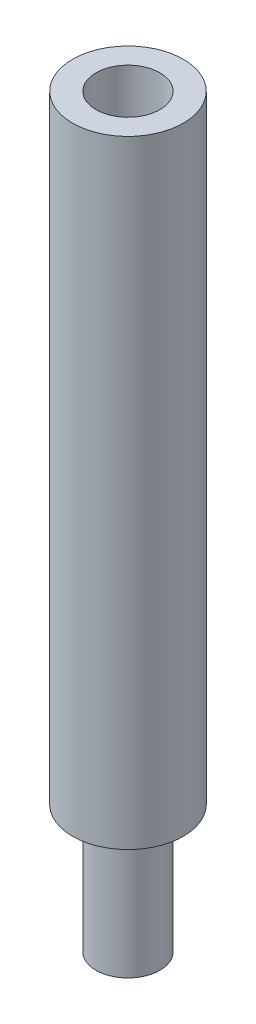
ISO-10303-21;
HEADER;
FILE_DESCRIPTION(('STEP AP214'),'2;1');
FILE_NAME('part.step','',(''),(''),'','','');
FILE_SCHEMA(('AUTOMOTIVE_DESIGN { 1 0 10303 214 1 1 1 1 }'));
ENDSEC;
DATA;
#1=APPLICATION_CONTEXT('core data for automotive mechanical design processes');
#2=APPLICATION_PROTOCOL_DEFINITION('international standard','automotive_design',2000,#1);
#3=PRODUCT_CONTEXT('',#1,'mechanical');
#4=PRODUCT('Part','Part','',(#3));
#5=PRODUCT_RELATED_PRODUCT_CATEGORY('part','',(#4));
#6=PRODUCT_DEFINITION_FORMATION('','',#4);
#7=PRODUCT_DEFINITION_CONTEXT('part definition',#1,'design');
#8=PRODUCT_DEFINITION('design','',#6,#7);
#9=PRODUCT_DEFINITION_SHAPE('','',#8);
#10=(LENGTH_UNIT() NAMED_UNIT(*) SI_UNIT(.MILLI.,.METRE.));
#11=(NAMED_UNIT(*) PLANE_ANGLE_UNIT() SI_UNIT($,.RADIAN.));
#12=(NAMED_UNIT(*) SI_UNIT($,.STERADIAN.) SOLID_ANGLE_UNIT());
#13=UNCERTAINTY_MEASURE_WITH_UNIT(LENGTH_MEASURE(1.E-05),#10,'distance_accuracy_value','');
#14=(GEOMETRIC_REPRESENTATION_CONTEXT(3) GLOBAL_UNCERTAINTY_ASSIGNED_CONTEXT((#13)) GLOBAL_UNIT_ASSIGNED_CONTEXT((#10,
#11,#12)) REPRESENTATION_CONTEXT('',''));
#15=CARTESIAN_POINT('',(0.,0.,0.));
#16=DIRECTION('',(0.,0.,1.));
#17=DIRECTION('',(1.,0.,0.));
#18=AXIS2_PLACEMENT_3D('',#15,#16,#17);
#19=CARTESIAN_POINT('',(0.,14.5,2.59999999999999));
#20=DIRECTION('',(0.,1.,0.));
#21=DIRECTION('',(0.,0.,1.));
#22=AXIS2_PLACEMENT_3D('',#19,#20,#21);
#23=PLANE('',#22);
#24=CARTESIAN_POINT('',(0.,14.5,0.));
#25=DIRECTION('',(0.,1.,0.));
#26=DIRECTION('',(0.,0.,1.));
#27=AXIS2_PLACEMENT_3D('',#24,#25,#26);
#28=CIRCLE('',#27,2.59999999999999);
#29=CARTESIAN_POINT('',(0.,14.5,2.59999999999999));
#30=VERTEX_POINT('',#29);
#31=EDGE_CURVE('E53',#30,#30,#28,.T.);
#32=ORIENTED_EDGE('',*,*,#31,.T.);
#33=EDGE_LOOP('',(#32));
#34=FACE_BOUND('',#33,.T.);
#35=CARTESIAN_POINT('',(0.,14.5,0.));
#36=DIRECTION('',(0.,1.,0.));
#37=DIRECTION('',(0.,0.,1.));
#38=AXIS2_PLACEMENT_3D('',#35,#36,#37);
#39=CIRCLE('',#38,1.49999999999999);
#40=CARTESIAN_POINT('',(0.,14.5,1.49999999999999));
#41=VERTEX_POINT('',#40);
#42=EDGE_CURVE('E10',#41,#41,#39,.T.);
#43=ORIENTED_EDGE('',*,*,#42,.F.);
#44=EDGE_LOOP('',(#43));
#45=FACE_BOUND('',#44,.T.);
#46=ADVANCED_FACE('F31',(#34,#45),#23,.T.);
#47=CARTESIAN_POINT('',(0.,27.5397967343063,0.));
#48=DIRECTION('',(0.,1.,0.));
#49=DIRECTION('',(0.,0.,1.));
#50=AXIS2_PLACEMENT_3D('',#47,#48,#49);
#51=CYLINDRICAL_SURFACE('',#50,1.5);
#52=ORIENTED_EDGE('',*,*,#42,.T.);
#53=EDGE_LOOP('',(#52));
#54=FACE_BOUND('',#53,.T.);
#55=CARTESIAN_POINT('',(0.,8.5,0.));
#56=DIRECTION('',(0.,1.,0.));
#57=DIRECTION('',(0.,0.,1.));
#58=AXIS2_PLACEMENT_3D('',#55,#56,#57);
#59=CIRCLE('',#58,1.5);
#60=CARTESIAN_POINT('',(0.,8.5,1.5));
#61=VERTEX_POINT('',#60);
#62=EDGE_CURVE('E37',#61,#61,#59,.T.);
#63=ORIENTED_EDGE('',*,*,#62,.F.);
#64=EDGE_LOOP('',(#63));
#65=FACE_BOUND('',#64,.T.);
#66=ADVANCED_FACE('F71',(#54,#65),#51,.F.);
#67=CARTESIAN_POINT('',(0.,8.5,1.5));
#68=DIRECTION('',(0.,1.,0.));
#69=DIRECTION('',(0.,0.,1.));
#70=AXIS2_PLACEMENT_3D('',#67,#68,#69);
#71=PLANE('',#70);
#72=ORIENTED_EDGE('',*,*,#62,.T.);
#73=EDGE_LOOP('',(#72));
#74=FACE_BOUND('',#73,.T.);
#75=ADVANCED_FACE('F75',(#74),#71,.T.);
#76=CARTESIAN_POINT('',(0.,-20.5,1.49999999999999));
#77=DIRECTION('',(0.,-1.,0.));
#78=DIRECTION('',(0.,0.,-1.));
#79=AXIS2_PLACEMENT_3D('',#76,#77,#78);
#80=PLANE('',#79);
#81=CARTESIAN_POINT('',(0.,-20.5,0.));
#82=DIRECTION('',(0.,1.,0.));
#83=DIRECTION('',(0.,0.,1.));
#84=AXIS2_PLACEMENT_3D('',#81,#82,#83);
#85=CIRCLE('',#84,1.49999999999999);
#86=CARTESIAN_POINT('',(0.,-20.5,1.49999999999999));
#87=VERTEX_POINT('',#86);
#88=EDGE_CURVE('E41',#87,#87,#85,.T.);
#89=ORIENTED_EDGE('',*,*,#88,.F.);
#90=EDGE_LOOP('',(#89));
#91=FACE_BOUND('',#90,.T.);
#92=ADVANCED_FACE('F79',(#91),#80,.T.);
#93=CARTESIAN_POINT('',(0.,27.5397967343063,0.));
#94=DIRECTION('',(0.,1.,0.));
#95=DIRECTION('',(0.,0.,1.));
#96=AXIS2_PLACEMENT_3D('',#93,#94,#95);
#97=CYLINDRICAL_SURFACE('',#96,1.49999999999999);
#98=ORIENTED_EDGE('',*,*,#88,.T.);
#99=EDGE_LOOP('',(#98));
#100=FACE_BOUND('',#99,.T.);
#101=CARTESIAN_POINT('',(0.,-14.5,0.));
#102=DIRECTION('',(0.,1.,0.));
#103=DIRECTION('',(0.,0.,1.));
#104=AXIS2_PLACEMENT_3D('',#101,#102,#103);
#105=CIRCLE('',#104,1.49999999999999);
#106=CARTESIAN_POINT('',(0.,-14.5,1.49999999999999));
#107=VERTEX_POINT('',#106);
#108=EDGE_CURVE('E45',#107,#107,#105,.T.);
#109=ORIENTED_EDGE('',*,*,#108,.F.);
#110=EDGE_LOOP('',(#109));
#111=FACE_BOUND('',#110,.T.);
#112=ADVANCED_FACE('F67',(#100,#111),#97,.T.);
#113=CARTESIAN_POINT('',(0.,-14.5,2.59999999999999));
#114=DIRECTION('',(0.,-1.,0.));
#115=DIRECTION('',(0.,0.,-1.));
#116=AXIS2_PLACEMENT_3D('',#113,#114,#115);
#117=PLANE('',#116);
#118=ORIENTED_EDGE('',*,*,#108,.T.);
#119=EDGE_LOOP('',(#118));
#120=FACE_BOUND('',#119,.T.);
#121=CARTESIAN_POINT('',(0.,-14.5,0.));
#122=DIRECTION('',(0.,1.,0.));
#123=DIRECTION('',(0.,0.,1.));
#124=AXIS2_PLACEMENT_3D('',#121,#122,#123);
#125=CIRCLE('',#124,2.59999999999999);
#126=CARTESIAN_POINT('',(0.,-14.5,2.59999999999999));
#127=VERTEX_POINT('',#126);
#128=EDGE_CURVE('E50',#127,#127,#125,.T.);
#129=ORIENTED_EDGE('',*,*,#128,.F.);
#130=EDGE_LOOP('',(#129));
#131=FACE_BOUND('',#130,.T.);
#132=ADVANCED_FACE('F61',(#120,#131),#117,.T.);
#133=CARTESIAN_POINT('',(0.,27.5397967343063,0.));
#134=DIRECTION('',(0.,1.,0.));
#135=DIRECTION('',(0.,0.,1.));
#136=AXIS2_PLACEMENT_3D('',#133,#134,#135);
#137=CYLINDRICAL_SURFACE('',#136,2.59999999999999);
#138=ORIENTED_EDGE('',*,*,#128,.T.);
#139=EDGE_LOOP('',(#138));
#140=FACE_BOUND('',#139,.T.);
#141=ORIENTED_EDGE('',*,*,#31,.F.);
#142=EDGE_LOOP('',(#141));
#143=FACE_BOUND('',#142,.T.);
#144=ADVANCED_FACE('F59',(#140,#143),#137,.T.);
#145=CLOSED_SHELL('',(#46,#66,#75,#92,#112,#132,#144));
#146=MANIFOLD_SOLID_BREP('B2',#145);
#147=ADVANCED_BREP_SHAPE_REPRESENTATION('',(#18,#146),#14);
#148=SHAPE_DEFINITION_REPRESENTATION(#9,#147);
ENDSEC;
END-ISO-10303-21;
